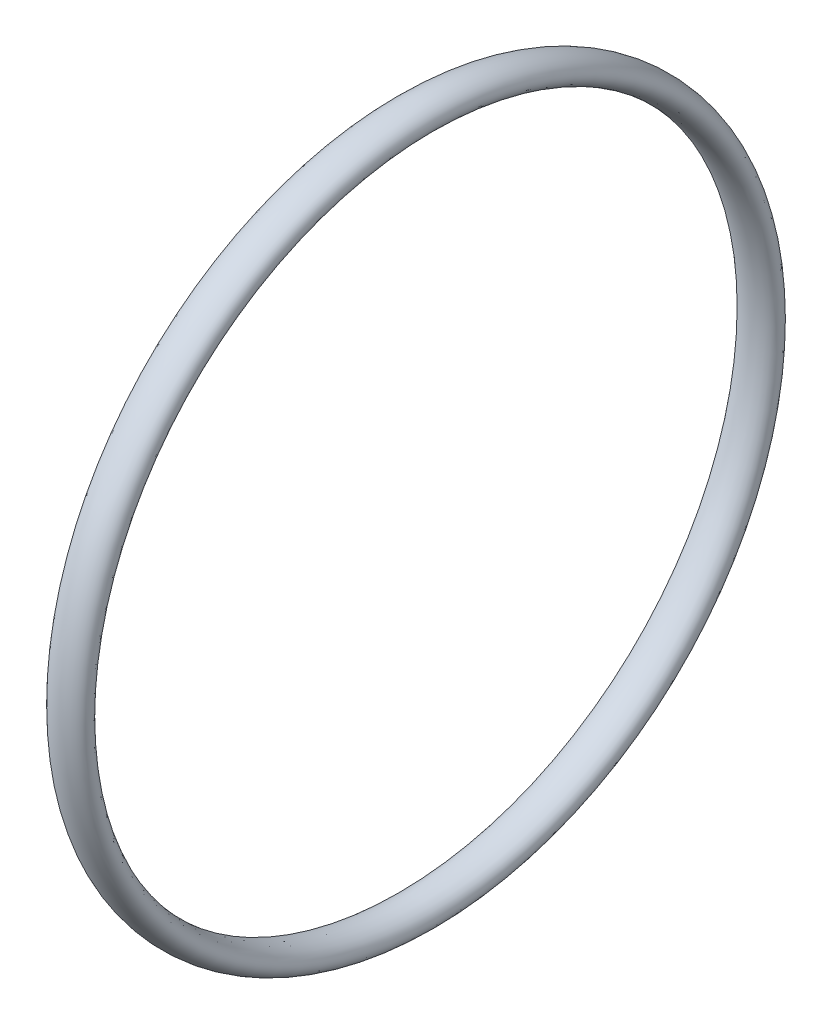
ISO-10303-21;
HEADER;
FILE_DESCRIPTION(('STEP AP214'),'2;1');
FILE_NAME('part.step','',(''),(''),'','','');
FILE_SCHEMA(('AUTOMOTIVE_DESIGN { 1 0 10303 214 1 1 1 1 }'));
ENDSEC;
DATA;
#1=APPLICATION_CONTEXT('core data for automotive mechanical design processes');
#2=APPLICATION_PROTOCOL_DEFINITION('international standard','automotive_design',2000,#1);
#3=PRODUCT_CONTEXT('',#1,'mechanical');
#4=PRODUCT('Part','Part','',(#3));
#5=PRODUCT_RELATED_PRODUCT_CATEGORY('part','',(#4));
#6=PRODUCT_DEFINITION_FORMATION('','',#4);
#7=PRODUCT_DEFINITION_CONTEXT('part definition',#1,'design');
#8=PRODUCT_DEFINITION('design','',#6,#7);
#9=PRODUCT_DEFINITION_SHAPE('','',#8);
#10=(LENGTH_UNIT() NAMED_UNIT(*) SI_UNIT(.MILLI.,.METRE.));
#11=(NAMED_UNIT(*) PLANE_ANGLE_UNIT() SI_UNIT($,.RADIAN.));
#12=(NAMED_UNIT(*) SI_UNIT($,.STERADIAN.) SOLID_ANGLE_UNIT());
#13=UNCERTAINTY_MEASURE_WITH_UNIT(LENGTH_MEASURE(1.E-05),#10,'distance_accuracy_value','');
#14=(GEOMETRIC_REPRESENTATION_CONTEXT(3) GLOBAL_UNCERTAINTY_ASSIGNED_CONTEXT((#13)) GLOBAL_UNIT_ASSIGNED_CONTEXT((#10,
#11,#12)) REPRESENTATION_CONTEXT('',''));
#15=CARTESIAN_POINT('',(0.,0.,0.));
#16=DIRECTION('',(0.,0.,1.));
#17=DIRECTION('',(1.,0.,0.));
#18=AXIS2_PLACEMENT_3D('',#15,#16,#17);
#19=CARTESIAN_POINT('',(0.,0.,-33.75));
#20=DIRECTION('',(0.,1.,0.));
#21=DIRECTION('',(-1.,0.,0.));
#22=AXIS2_PLACEMENT_3D('',#19,#20,#21);
#23=ELLIPSE('',#22,2.,1.25);
#24=CARTESIAN_POINT('',(-88.99,0.,0.));
#25=DIRECTION('',(-1.,0.,0.));
#26=AXIS1_PLACEMENT('',#24,#25);
#27=SURFACE_OF_REVOLUTION('',#23,#26);
#28=ADVANCED_FACE('F38',(),#27,.T.);
#29=CLOSED_SHELL('',(#28));
#30=MANIFOLD_SOLID_BREP('B2',#29);
#31=ADVANCED_BREP_SHAPE_REPRESENTATION('',(#18,#30),#14);
#32=SHAPE_DEFINITION_REPRESENTATION(#9,#31);
ENDSEC;
END-ISO-10303-21;
